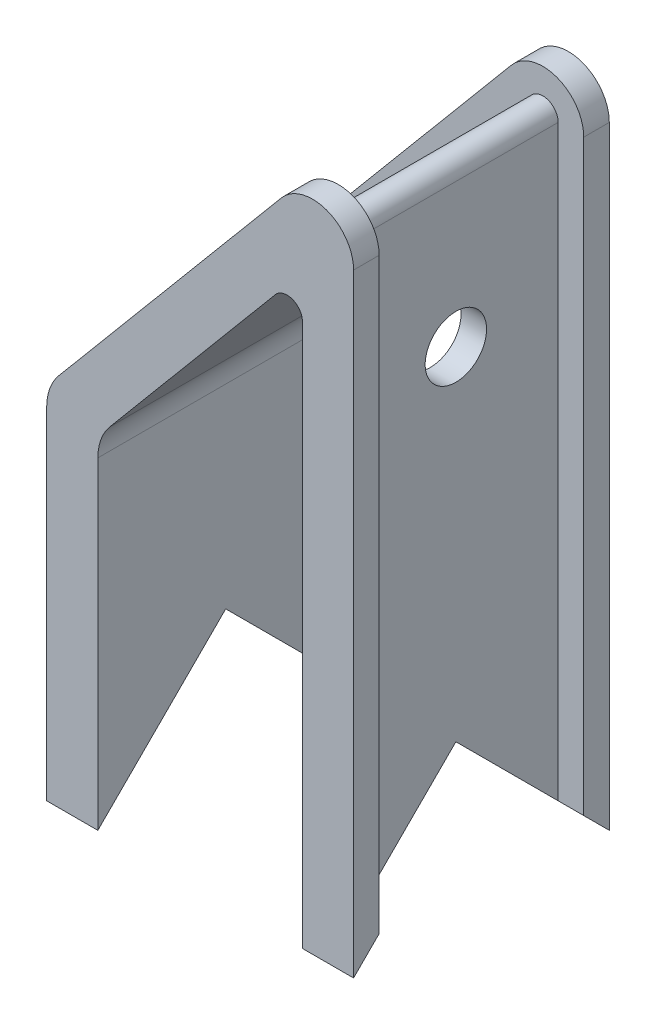
ISO-10303-21;
HEADER;
FILE_DESCRIPTION(('STEP AP214'),'2;1');
FILE_NAME('part.step','',(''),(''),'','','');
FILE_SCHEMA(('AUTOMOTIVE_DESIGN { 1 0 10303 214 1 1 1 1 }'));
ENDSEC;
DATA;
#1=APPLICATION_CONTEXT('core data for automotive mechanical design processes');
#2=APPLICATION_PROTOCOL_DEFINITION('international standard','automotive_design',2000,#1);
#3=PRODUCT_CONTEXT('',#1,'mechanical');
#4=PRODUCT('Part','Part','',(#3));
#5=PRODUCT_RELATED_PRODUCT_CATEGORY('part','',(#4));
#6=PRODUCT_DEFINITION_FORMATION('','',#4);
#7=PRODUCT_DEFINITION_CONTEXT('part definition',#1,'design');
#8=PRODUCT_DEFINITION('design','',#6,#7);
#9=PRODUCT_DEFINITION_SHAPE('','',#8);
#10=(LENGTH_UNIT() NAMED_UNIT(*) SI_UNIT(.MILLI.,.METRE.));
#11=(NAMED_UNIT(*) PLANE_ANGLE_UNIT() SI_UNIT($,.RADIAN.));
#12=(NAMED_UNIT(*) SI_UNIT($,.STERADIAN.) SOLID_ANGLE_UNIT());
#13=UNCERTAINTY_MEASURE_WITH_UNIT(LENGTH_MEASURE(1.E-05),#10,'distance_accuracy_value','');
#14=(GEOMETRIC_REPRESENTATION_CONTEXT(3) GLOBAL_UNCERTAINTY_ASSIGNED_CONTEXT((#13)) GLOBAL_UNIT_ASSIGNED_CONTEXT((#10,
#11,#12)) REPRESENTATION_CONTEXT('',''));
#15=CARTESIAN_POINT('',(0.,0.,0.));
#16=DIRECTION('',(0.,0.,1.));
#17=DIRECTION('',(1.,0.,0.));
#18=AXIS2_PLACEMENT_3D('',#15,#16,#17);
#19=CARTESIAN_POINT('',(5.,-20.7161125319693,50.));
#20=DIRECTION('',(-1.,0.,0.));
#21=DIRECTION('',(0.,0.,1.));
#22=AXIS2_PLACEMENT_3D('',#19,#20,#21);
#23=PLANE('',#22);
#24=DIRECTION('',(0.,1.,0.));
#25=VECTOR('',#24,1.);
#26=CARTESIAN_POINT('',(5.,-20.7161125319693,5.));
#27=LINE('',#26,#25);
#28=CARTESIAN_POINT('',(5.,-0.829803518152818,5.));
#29=VERTEX_POINT('',#28);
#30=CARTESIAN_POINT('',(5.,114.041455209667,4.99999999999999));
#31=VERTEX_POINT('',#30);
#32=EDGE_CURVE('E258',#29,#31,#27,.T.);
#33=ORIENTED_EDGE('',*,*,#32,.F.);
#34=DIRECTION('',(0.,0.7071067811865,0.707106781186595));
#35=VECTOR('',#34,1.);
#36=CARTESIAN_POINT('',(5.,-5.82980351815215,0.));
#37=LINE('',#36,#35);
#38=CARTESIAN_POINT('',(5.,-5.82980351815215,0.));
#39=VERTEX_POINT('',#38);
#40=EDGE_CURVE('E238',#39,#29,#37,.T.);
#41=ORIENTED_EDGE('',*,*,#40,.F.);
#42=DIRECTION('',(0.,1.,0.));
#43=VECTOR('',#42,1.);
#44=CARTESIAN_POINT('',(5.,-20.7161125319693,0.));
#45=LINE('',#44,#43);
#46=CARTESIAN_POINT('',(5.,114.041455209667,0.));
#47=VERTEX_POINT('',#46);
#48=EDGE_CURVE('E246',#39,#47,#45,.T.);
#49=ORIENTED_EDGE('',*,*,#48,.T.);
#50=DIRECTION('',(0.,0.,-1.));
#51=VECTOR('',#50,1.);
#52=CARTESIAN_POINT('',(5.,114.041455209667,50.));
#53=LINE('',#52,#51);
#54=EDGE_CURVE('E254',#47,#31,#53,.F.);
#55=ORIENTED_EDGE('',*,*,#54,.T.);
#56=EDGE_LOOP('',(#33,#41,#49,#55));
#57=FACE_BOUND('',#56,.T.);
#58=ADVANCED_FACE('F44',(#57),#23,.F.);
#59=DIRECTION('',(0.,1.,0.));
#60=VECTOR('',#59,1.);
#61=CARTESIAN_POINT('',(5.,-20.7161125319693,50.));
#62=LINE('',#61,#60);
#63=CARTESIAN_POINT('',(5.,-5.82980351815547,50.));
#64=VERTEX_POINT('',#63);
#65=CARTESIAN_POINT('',(5.,114.041455209667,50.));
#66=VERTEX_POINT('',#65);
#67=EDGE_CURVE('E278',#64,#66,#62,.T.);
#68=ORIENTED_EDGE('',*,*,#67,.F.);
#69=DIRECTION('',(0.,-0.707106781186547,0.707106781186548));
#70=VECTOR('',#69,1.);
#71=CARTESIAN_POINT('',(5.,19.1701964818445,25.));
#72=LINE('',#71,#70);
#73=CARTESIAN_POINT('',(5.,-0.829803518155477,45.));
#74=VERTEX_POINT('',#73);
#75=EDGE_CURVE('E96',#74,#64,#72,.T.);
#76=ORIENTED_EDGE('',*,*,#75,.F.);
#77=DIRECTION('',(0.,-1.,0.));
#78=VECTOR('',#77,1.);
#79=CARTESIAN_POINT('',(5.,-20.7161125319693,45.));
#80=LINE('',#79,#78);
#81=CARTESIAN_POINT('',(5.,114.041455209667,45.));
#82=VERTEX_POINT('',#81);
#83=EDGE_CURVE('E281',#82,#74,#80,.T.);
#84=ORIENTED_EDGE('',*,*,#83,.F.);
#85=DIRECTION('',(0.,0.,-1.));
#86=VECTOR('',#85,1.);
#87=CARTESIAN_POINT('',(5.,114.041455209667,50.));
#88=LINE('',#87,#86);
#89=EDGE_CURVE('E330',#82,#66,#88,.F.);
#90=ORIENTED_EDGE('',*,*,#89,.T.);
#91=EDGE_LOOP('',(#68,#76,#84,#90));
#92=FACE_BOUND('',#91,.T.);
#93=ADVANCED_FACE('F327',(#92),#23,.F.);
#94=CARTESIAN_POINT('',(5.,136.021274565304,50.));
#95=DIRECTION('',(0.766044443118977,-0.64278760968654,0.));
#96=DIRECTION('',(0.64278760968654,0.766044443118977,0.));
#97=AXIS2_PLACEMENT_3D('',#94,#95,#96);
#98=PLANE('',#97);
#99=DIRECTION('',(-0.64278760968654,-0.766044443118977,0.));
#100=VECTOR('',#99,1.);
#101=CARTESIAN_POINT('',(5.,136.021274565304,50.));
#102=LINE('',#101,#100);
#103=CARTESIAN_POINT('',(-9.12835554495182,119.183756087159,50.));
#104=VERTEX_POINT('',#103);
#105=CARTESIAN_POINT('',(-52.6604444311898,67.3042327638547,50.));
#106=VERTEX_POINT('',#105);
#107=EDGE_CURVE('E339',#104,#106,#102,.T.);
#108=ORIENTED_EDGE('',*,*,#107,.F.);
#109=DIRECTION('',(0.,0.,-1.));
#110=VECTOR('',#109,1.);
#111=CARTESIAN_POINT('',(-9.12835554495182,119.183756087159,50.));
#112=LINE('',#111,#110);
#113=CARTESIAN_POINT('',(-9.12835554495182,119.183756087159,45.));
#114=VERTEX_POINT('',#113);
#115=EDGE_CURVE('E333',#104,#114,#112,.T.);
#116=ORIENTED_EDGE('',*,*,#115,.T.);
#117=DIRECTION('',(0.64278760968654,0.766044443118977,0.));
#118=VECTOR('',#117,1.);
#119=CARTESIAN_POINT('',(-19.7895698622391,106.478215623115,45.));
#120=LINE('',#119,#118);
#121=CARTESIAN_POINT('',(-52.6604444311898,67.3042327638547,45.));
#122=VERTEX_POINT('',#121);
#123=EDGE_CURVE('E350',#122,#114,#120,.T.);
#124=ORIENTED_EDGE('',*,*,#123,.F.);
#125=DIRECTION('',(0.,0.,-1.));
#126=VECTOR('',#125,1.);
#127=CARTESIAN_POINT('',(-52.6604444311898,67.3042327638547,50.));
#128=LINE('',#127,#126);
#129=EDGE_CURVE('E352',#122,#106,#128,.F.);
#130=ORIENTED_EDGE('',*,*,#129,.T.);
#131=EDGE_LOOP('',(#108,#116,#124,#130));
#132=FACE_BOUND('',#131,.T.);
#133=ADVANCED_FACE('F488',(#132),#98,.F.);
#134=DIRECTION('',(-0.64278760968654,-0.766044443118977,0.));
#135=VECTOR('',#134,1.);
#136=CARTESIAN_POINT('',(-17.7236903064065,108.940235005646,5.));
#137=LINE('',#136,#135);
#138=CARTESIAN_POINT('',(-9.12835554495182,119.183756087159,5.));
#139=VERTEX_POINT('',#138);
#140=CARTESIAN_POINT('',(-52.6604444311898,67.3042327638547,5.));
#141=VERTEX_POINT('',#140);
#142=EDGE_CURVE('E354',#139,#141,#137,.T.);
#143=ORIENTED_EDGE('',*,*,#142,.F.);
#144=DIRECTION('',(0.,0.,-1.));
#145=VECTOR('',#144,1.);
#146=CARTESIAN_POINT('',(-9.12835554495182,119.183756087159,50.));
#147=LINE('',#146,#145);
#148=CARTESIAN_POINT('',(-9.12835554495182,119.183756087159,0.));
#149=VERTEX_POINT('',#148);
#150=EDGE_CURVE('E359',#139,#149,#147,.T.);
#151=ORIENTED_EDGE('',*,*,#150,.T.);
#152=DIRECTION('',(-0.64278760968654,-0.766044443118977,0.));
#153=VECTOR('',#152,1.);
#154=CARTESIAN_POINT('',(5.,136.021274565304,0.));
#155=LINE('',#154,#153);
#156=CARTESIAN_POINT('',(-52.6604444311898,67.3042327638547,0.));
#157=VERTEX_POINT('',#156);
#158=EDGE_CURVE('E362',#149,#157,#155,.T.);
#159=ORIENTED_EDGE('',*,*,#158,.T.);
#160=DIRECTION('',(0.,0.,-1.));
#161=VECTOR('',#160,1.);
#162=CARTESIAN_POINT('',(-52.6604444311898,67.3042327638547,50.));
#163=LINE('',#162,#161);
#164=EDGE_CURVE('E302',#157,#141,#163,.F.);
#165=ORIENTED_EDGE('',*,*,#164,.T.);
#166=EDGE_LOOP('',(#143,#151,#159,#165));
#167=FACE_BOUND('',#166,.T.);
#168=ADVANCED_FACE('F490',(#167),#98,.F.);
#169=CARTESIAN_POINT('',(-55.,64.5160590096513,50.));
#170=DIRECTION('',(1.,0.,0.));
#171=DIRECTION('',(0.,1.,0.));
#172=AXIS2_PLACEMENT_3D('',#169,#170,#171);
#173=PLANE('',#172);
#174=DIRECTION('',(0.,-1.,0.));
#175=VECTOR('',#174,1.);
#176=CARTESIAN_POINT('',(-55.,64.5160590096513,0.));
#177=LINE('',#176,#175);
#178=CARTESIAN_POINT('',(-55.,60.8763566669893,0.));
#179=VERTEX_POINT('',#178);
#180=CARTESIAN_POINT('',(-55.,-5.82980351815215,0.));
#181=VERTEX_POINT('',#180);
#182=EDGE_CURVE('E272',#179,#181,#177,.T.);
#183=ORIENTED_EDGE('',*,*,#182,.T.);
#184=DIRECTION('',(0.,0.7071067811865,0.707106781186595));
#185=VECTOR('',#184,1.);
#186=CARTESIAN_POINT('',(-55.,-5.82980351815215,0.));
#187=LINE('',#186,#185);
#188=CARTESIAN_POINT('',(-55.,-0.829803518152818,5.));
#189=VERTEX_POINT('',#188);
#190=EDGE_CURVE('E268',#181,#189,#187,.T.);
#191=ORIENTED_EDGE('',*,*,#190,.T.);
#192=DIRECTION('',(0.,-1.,0.));
#193=VECTOR('',#192,1.);
#194=CARTESIAN_POINT('',(-55.,136.023274565304,5.));
#195=LINE('',#194,#193);
#196=CARTESIAN_POINT('',(-55.,60.8763566669893,5.));
#197=VERTEX_POINT('',#196);
#198=EDGE_CURVE('E306',#197,#189,#195,.T.);
#199=ORIENTED_EDGE('',*,*,#198,.F.);
#200=DIRECTION('',(0.,0.,-1.));
#201=VECTOR('',#200,1.);
#202=CARTESIAN_POINT('',(-55.,60.8763566669893,50.));
#203=LINE('',#202,#201);
#204=EDGE_CURVE('E271',#197,#179,#203,.T.);
#205=ORIENTED_EDGE('',*,*,#204,.T.);
#206=EDGE_LOOP('',(#183,#191,#199,#205));
#207=FACE_BOUND('',#206,.T.);
#208=ADVANCED_FACE('F469',(#207),#173,.F.);
#209=DIRECTION('',(0.,-1.,0.));
#210=VECTOR('',#209,1.);
#211=CARTESIAN_POINT('',(-55.,136.023274565304,45.));
#212=LINE('',#211,#210);
#213=CARTESIAN_POINT('',(-55.,60.8763566669893,45.));
#214=VERTEX_POINT('',#213);
#215=CARTESIAN_POINT('',(-55.,-0.829803518155481,45.));
#216=VERTEX_POINT('',#215);
#217=EDGE_CURVE('E267',#214,#216,#212,.T.);
#218=ORIENTED_EDGE('',*,*,#217,.T.);
#219=DIRECTION('',(0.,-0.707106781186547,0.707106781186548));
#220=VECTOR('',#219,1.);
#221=CARTESIAN_POINT('',(-55.,19.1701964818445,25.));
#222=LINE('',#221,#220);
#223=CARTESIAN_POINT('',(-55.,-5.82980351815547,50.));
#224=VERTEX_POINT('',#223);
#225=EDGE_CURVE('E226',#216,#224,#222,.T.);
#226=ORIENTED_EDGE('',*,*,#225,.T.);
#227=DIRECTION('',(0.,-1.,0.));
#228=VECTOR('',#227,1.);
#229=CARTESIAN_POINT('',(-55.,64.5160590096513,50.));
#230=LINE('',#229,#228);
#231=CARTESIAN_POINT('',(-55.,60.8763566669893,50.));
#232=VERTEX_POINT('',#231);
#233=EDGE_CURVE('E292',#232,#224,#230,.T.);
#234=ORIENTED_EDGE('',*,*,#233,.F.);
#235=DIRECTION('',(0.,0.,-1.));
#236=VECTOR('',#235,1.);
#237=CARTESIAN_POINT('',(-55.,60.8763566669893,50.));
#238=LINE('',#237,#236);
#239=EDGE_CURVE('E266',#232,#214,#238,.T.);
#240=ORIENTED_EDGE('',*,*,#239,.T.);
#241=EDGE_LOOP('',(#218,#226,#234,#240));
#242=FACE_BOUND('',#241,.T.);
#243=ADVANCED_FACE('F46',(#242),#173,.F.);
#244=CARTESIAN_POINT('',(-45.,60.8763566669893,50.));
#245=DIRECTION('',(-1.,0.,0.));
#246=DIRECTION('',(0.,-1.,0.));
#247=AXIS2_PLACEMENT_3D('',#244,#245,#246);
#248=PLANE('',#247);
#249=DIRECTION('',(0.,1.,0.));
#250=VECTOR('',#249,1.);
#251=CARTESIAN_POINT('',(-45.,60.8763566669893,50.));
#252=LINE('',#251,#250);
#253=CARTESIAN_POINT('',(-45.,-5.82980351815547,50.));
#254=VERTEX_POINT('',#253);
#255=CARTESIAN_POINT('',(-45.,57.2366543243273,50.));
#256=VERTEX_POINT('',#255);
#257=EDGE_CURVE('E316',#254,#256,#252,.T.);
#258=ORIENTED_EDGE('',*,*,#257,.F.);
#259=DIRECTION('',(0.,0.707106781186547,-0.707106781186548));
#260=VECTOR('',#259,1.);
#261=CARTESIAN_POINT('',(-45.,27.5232765744168,16.6469199074276));
#262=LINE('',#261,#260);
#263=CARTESIAN_POINT('',(-45.,19.1701964818445,25.));
#264=VERTEX_POINT('',#263);
#265=EDGE_CURVE('E403',#254,#264,#262,.T.);
#266=ORIENTED_EDGE('',*,*,#265,.T.);
#267=DIRECTION('',(0.,-0.7071067811865,-0.707106781186595));
#268=VECTOR('',#267,1.);
#269=CARTESIAN_POINT('',(-45.,52.5232765744141,58.3530800925741));
#270=LINE('',#269,#268);
#271=CARTESIAN_POINT('',(-45.,-5.82980351815215,0.));
#272=VERTEX_POINT('',#271);
#273=EDGE_CURVE('E63',#264,#272,#270,.T.);
#274=ORIENTED_EDGE('',*,*,#273,.T.);
#275=DIRECTION('',(0.,1.,0.));
#276=VECTOR('',#275,1.);
#277=CARTESIAN_POINT('',(-45.,60.8763566669893,0.));
#278=LINE('',#277,#276);
#279=CARTESIAN_POINT('',(-45.,57.2366543243273,0.));
#280=VERTEX_POINT('',#279);
#281=EDGE_CURVE('E303',#272,#280,#278,.T.);
#282=ORIENTED_EDGE('',*,*,#281,.T.);
#283=DIRECTION('',(0.,0.,-1.));
#284=VECTOR('',#283,1.);
#285=CARTESIAN_POINT('',(-45.,57.2366543243273,50.));
#286=LINE('',#285,#284);
#287=EDGE_CURVE('E305',#280,#256,#286,.F.);
#288=ORIENTED_EDGE('',*,*,#287,.T.);
#289=EDGE_LOOP('',(#258,#266,#274,#282,#288));
#290=FACE_BOUND('',#289,.T.);
#291=ADVANCED_FACE('F477',(#290),#248,.F.);
#292=CARTESIAN_POINT('',(-5.,108.546500370758,50.));
#293=DIRECTION('',(-0.766044443118977,0.64278760968654,0.));
#294=DIRECTION('',(-0.64278760968654,-0.766044443118977,0.));
#295=AXIS2_PLACEMENT_3D('',#292,#293,#294);
#296=PLANE('',#295);
#297=CARTESIAN_POINT('',(-20.7515394043582,89.7745466967245,25.));
#298=DIRECTION('',(-0.766044443118977,0.64278760968654,0.));
#299=DIRECTION('',(-0.64278760968654,-0.766044443118977,0.));
#300=AXIS2_PLACEMENT_3D('',#297,#298,#299);
#301=CIRCLE('',#300,6.);
#302=CARTESIAN_POINT('',(-24.6082650624775,85.1782800380106,25.));
#303=VERTEX_POINT('',#302);
#304=EDGE_CURVE('E255',#303,#303,#301,.F.);
#305=ORIENTED_EDGE('',*,*,#304,.F.);
#306=EDGE_LOOP('',(#305));
#307=FACE_BOUND('',#306,.T.);
#308=DIRECTION('',(0.64278760968654,0.766044443118977,0.));
#309=VECTOR('',#308,1.);
#310=CARTESIAN_POINT('',(-5.,108.546500370758,0.));
#311=LINE('',#310,#309);
#312=CARTESIAN_POINT('',(-42.6604444311898,63.6645304211927,0.));
#313=VERTEX_POINT('',#312);
#314=CARTESIAN_POINT('',(-10.2981333293569,102.232430941453,0.));
#315=VERTEX_POINT('',#314);
#316=EDGE_CURVE('E374',#313,#315,#311,.T.);
#317=ORIENTED_EDGE('',*,*,#316,.T.);
#318=DIRECTION('',(0.,0.,-1.));
#319=VECTOR('',#318,1.);
#320=CARTESIAN_POINT('',(-10.2981333293569,102.232430941453,50.));
#321=LINE('',#320,#319);
#322=CARTESIAN_POINT('',(-10.2981333293569,102.232430941453,50.));
#323=VERTEX_POINT('',#322);
#324=EDGE_CURVE('E371',#315,#323,#321,.F.);
#325=ORIENTED_EDGE('',*,*,#324,.T.);
#326=DIRECTION('',(0.64278760968654,0.766044443118977,0.));
#327=VECTOR('',#326,1.);
#328=CARTESIAN_POINT('',(-5.,108.546500370758,50.));
#329=LINE('',#328,#327);
#330=CARTESIAN_POINT('',(-42.6604444311898,63.6645304211927,50.));
#331=VERTEX_POINT('',#330);
#332=EDGE_CURVE('E364',#331,#323,#329,.T.);
#333=ORIENTED_EDGE('',*,*,#332,.F.);
#334=DIRECTION('',(0.,0.,-1.));
#335=VECTOR('',#334,1.);
#336=CARTESIAN_POINT('',(-42.6604444311898,63.6645304211927,0.));
#337=LINE('',#336,#335);
#338=EDGE_CURVE('E373',#331,#313,#337,.T.);
#339=ORIENTED_EDGE('',*,*,#338,.T.);
#340=EDGE_LOOP('',(#317,#325,#333,#339));
#341=FACE_BOUND('',#340,.T.);
#342=ADVANCED_FACE('F517',(#307,#341),#296,.F.);
#343=CARTESIAN_POINT('',(-5.,-20.7161125319693,50.));
#344=DIRECTION('',(1.,0.,0.));
#345=DIRECTION('',(0.,0.,-1.));
#346=AXIS2_PLACEMENT_3D('',#343,#344,#345);
#347=PLANE('',#346);
#348=CARTESIAN_POINT('',(-5.,86.0414552096669,25.));
#349=DIRECTION('',(1.,0.,0.));
#350=DIRECTION('',(0.,0.,-1.));
#351=AXIS2_PLACEMENT_3D('',#348,#349,#350);
#352=CIRCLE('',#351,6.00000000000001);
#353=CARTESIAN_POINT('',(-5.,86.0414552096669,19.));
#354=VERTEX_POINT('',#353);
#355=EDGE_CURVE('E822',#354,#354,#352,.F.);
#356=ORIENTED_EDGE('',*,*,#355,.F.);
#357=EDGE_LOOP('',(#356));
#358=FACE_BOUND('',#357,.T.);
#359=DIRECTION('',(0.,0.7071067811865,0.707106781186595));
#360=VECTOR('',#359,1.);
#361=CARTESIAN_POINT('',(-5.,11.7270419749403,17.5568454930948));
#362=LINE('',#361,#360);
#363=CARTESIAN_POINT('',(-5.,-5.82980351815215,0.));
#364=VERTEX_POINT('',#363);
#365=CARTESIAN_POINT('',(-5.,19.1701964818445,25.));
#366=VERTEX_POINT('',#365);
#367=EDGE_CURVE('E240',#364,#366,#362,.T.);
#368=ORIENTED_EDGE('',*,*,#367,.T.);
#369=DIRECTION('',(0.,-0.707106781186547,0.707106781186548));
#370=VECTOR('',#369,1.);
#371=CARTESIAN_POINT('',(-5.,-13.2729580250624,57.4431545069069));
#372=LINE('',#371,#370);
#373=CARTESIAN_POINT('',(-5.,-5.82980351815547,50.));
#374=VERTEX_POINT('',#373);
#375=EDGE_CURVE('E377',#366,#374,#372,.T.);
#376=ORIENTED_EDGE('',*,*,#375,.T.);
#377=DIRECTION('',(0.,-1.,0.));
#378=VECTOR('',#377,1.);
#379=CARTESIAN_POINT('',(-5.,-20.7161125319693,50.));
#380=LINE('',#379,#378);
#381=CARTESIAN_POINT('',(-5.,100.304068112394,50.));
#382=VERTEX_POINT('',#381);
#383=EDGE_CURVE('E273',#382,#374,#380,.T.);
#384=ORIENTED_EDGE('',*,*,#383,.F.);
#385=DIRECTION('',(0.,0.,-1.));
#386=VECTOR('',#385,1.);
#387=CARTESIAN_POINT('',(-5.,100.304068112394,0.));
#388=LINE('',#387,#386);
#389=CARTESIAN_POINT('',(-5.,100.304068112394,0.));
#390=VERTEX_POINT('',#389);
#391=EDGE_CURVE('E293',#382,#390,#388,.T.);
#392=ORIENTED_EDGE('',*,*,#391,.T.);
#393=DIRECTION('',(0.,-1.,0.));
#394=VECTOR('',#393,1.);
#395=CARTESIAN_POINT('',(-5.,-20.7161125319693,0.));
#396=LINE('',#395,#394);
#397=EDGE_CURVE('E290',#390,#364,#396,.T.);
#398=ORIENTED_EDGE('',*,*,#397,.T.);
#399=EDGE_LOOP('',(#368,#376,#384,#392,#398));
#400=FACE_BOUND('',#399,.T.);
#401=ADVANCED_FACE('F505',(#358,#400),#347,.F.);
#402=CARTESIAN_POINT('',(0.,0.,50.));
#403=DIRECTION('',(0.,0.,-1.));
#404=DIRECTION('',(-1.,0.,0.));
#405=AXIS2_PLACEMENT_3D('',#402,#403,#404);
#406=PLANE('',#405);
#407=ORIENTED_EDGE('',*,*,#233,.T.);
#408=DIRECTION('',(1.,0.,0.));
#409=VECTOR('',#408,1.);
#410=CARTESIAN_POINT('',(-55.,-5.82980351815547,50.));
#411=LINE('',#410,#409);
#412=EDGE_CURVE('E229',#224,#254,#411,.T.);
#413=ORIENTED_EDGE('',*,*,#412,.T.);
#414=ORIENTED_EDGE('',*,*,#257,.T.);
#415=CARTESIAN_POINT('',(-35.,57.2366543243273,50.));
#416=DIRECTION('',(0.,0.,-1.));
#417=DIRECTION('',(-1.,0.,0.));
#418=AXIS2_PLACEMENT_3D('',#415,#416,#417);
#419=CIRCLE('',#418,10.);
#420=EDGE_CURVE('E317',#256,#331,#419,.T.);
#421=ORIENTED_EDGE('',*,*,#420,.T.);
#422=ORIENTED_EDGE('',*,*,#332,.T.);
#423=CARTESIAN_POINT('',(-8.,100.304068112394,50.));
#424=DIRECTION('',(0.,0.,-1.));
#425=DIRECTION('',(-1.,0.,0.));
#426=AXIS2_PLACEMENT_3D('',#423,#424,#425);
#427=CIRCLE('',#426,3.);
#428=EDGE_CURVE('E277',#323,#382,#427,.T.);
#429=ORIENTED_EDGE('',*,*,#428,.T.);
#430=ORIENTED_EDGE('',*,*,#383,.T.);
#431=EDGE_CURVE('E276',#374,#64,#411,.T.);
#432=ORIENTED_EDGE('',*,*,#431,.T.);
#433=ORIENTED_EDGE('',*,*,#67,.T.);
#434=CARTESIAN_POINT('',(-3.,114.041455209667,50.));
#435=DIRECTION('',(0.,0.,-1.));
#436=DIRECTION('',(-1.,0.,0.));
#437=AXIS2_PLACEMENT_3D('',#434,#435,#436);
#438=CIRCLE('',#437,8.);
#439=EDGE_CURVE('E280',#66,#104,#438,.F.);
#440=ORIENTED_EDGE('',*,*,#439,.T.);
#441=ORIENTED_EDGE('',*,*,#107,.T.);
#442=CARTESIAN_POINT('',(-45.,60.8763566669893,50.));
#443=DIRECTION('',(0.,0.,-1.));
#444=DIRECTION('',(-1.,0.,0.));
#445=AXIS2_PLACEMENT_3D('',#442,#443,#444);
#446=CIRCLE('',#445,10.);
#447=EDGE_CURVE('E341',#106,#232,#446,.F.);
#448=ORIENTED_EDGE('',*,*,#447,.T.);
#449=EDGE_LOOP('',(#407,#413,#414,#421,#422,#429,#430,#432,#433,#440,#441,#448));
#450=FACE_BOUND('',#449,.T.);
#451=ADVANCED_FACE('F322',(#450),#406,.F.);
#452=CARTESIAN_POINT('',(0.,0.,0.));
#453=DIRECTION('',(0.,0.,-1.));
#454=DIRECTION('',(-1.,0.,0.));
#455=AXIS2_PLACEMENT_3D('',#452,#453,#454);
#456=PLANE('',#455);
#457=DIRECTION('',(1.,0.,0.));
#458=VECTOR('',#457,1.);
#459=CARTESIAN_POINT('',(-55.,-5.82980351815215,0.));
#460=LINE('',#459,#458);
#461=EDGE_CURVE('E11',#181,#272,#460,.T.);
#462=ORIENTED_EDGE('',*,*,#461,.F.);
#463=ORIENTED_EDGE('',*,*,#182,.F.);
#464=CARTESIAN_POINT('',(-45.,60.8763566669893,0.));
#465=DIRECTION('',(0.,0.,-1.));
#466=DIRECTION('',(-1.,0.,0.));
#467=AXIS2_PLACEMENT_3D('',#464,#465,#466);
#468=CIRCLE('',#467,10.);
#469=EDGE_CURVE('E358',#179,#157,#468,.T.);
#470=ORIENTED_EDGE('',*,*,#469,.T.);
#471=ORIENTED_EDGE('',*,*,#158,.F.);
#472=CARTESIAN_POINT('',(-3.,114.041455209667,0.));
#473=DIRECTION('',(0.,0.,-1.));
#474=DIRECTION('',(-1.,0.,0.));
#475=AXIS2_PLACEMENT_3D('',#472,#473,#474);
#476=CIRCLE('',#475,8.);
#477=EDGE_CURVE('E250',#149,#47,#476,.T.);
#478=ORIENTED_EDGE('',*,*,#477,.T.);
#479=ORIENTED_EDGE('',*,*,#48,.F.);
#480=EDGE_CURVE('E56',#364,#39,#460,.T.);
#481=ORIENTED_EDGE('',*,*,#480,.F.);
#482=ORIENTED_EDGE('',*,*,#397,.F.);
#483=CARTESIAN_POINT('',(-8.,100.304068112394,0.));
#484=DIRECTION('',(0.,0.,-1.));
#485=DIRECTION('',(-1.,0.,0.));
#486=AXIS2_PLACEMENT_3D('',#483,#484,#485);
#487=CIRCLE('',#486,3.);
#488=EDGE_CURVE('E357',#390,#315,#487,.F.);
#489=ORIENTED_EDGE('',*,*,#488,.T.);
#490=ORIENTED_EDGE('',*,*,#316,.F.);
#491=CARTESIAN_POINT('',(-35.,57.2366543243273,0.));
#492=DIRECTION('',(0.,0.,-1.));
#493=DIRECTION('',(-1.,0.,0.));
#494=AXIS2_PLACEMENT_3D('',#491,#492,#493);
#495=CIRCLE('',#494,10.);
#496=EDGE_CURVE('E310',#313,#280,#495,.F.);
#497=ORIENTED_EDGE('',*,*,#496,.T.);
#498=ORIENTED_EDGE('',*,*,#281,.F.);
#499=EDGE_LOOP('',(#462,#463,#470,#471,#478,#479,#481,#482,#489,#490,#497,#498));
#500=FACE_BOUND('',#499,.T.);
#501=ADVANCED_FACE('F248',(#500),#456,.T.);
#502=CARTESIAN_POINT('',(-50.,136.023274565304,5.));
#503=DIRECTION('',(0.,0.,-1.));
#504=DIRECTION('',(-1.,0.,0.));
#505=AXIS2_PLACEMENT_3D('',#502,#503,#504);
#506=PLANE('',#505);
#507=ORIENTED_EDGE('',*,*,#198,.T.);
#508=DIRECTION('',(1.,0.,0.));
#509=VECTOR('',#508,1.);
#510=CARTESIAN_POINT('',(-50.,-0.829803518152816,5.));
#511=LINE('',#510,#509);
#512=CARTESIAN_POINT('',(-50.,-0.82980351815283,5.));
#513=VERTEX_POINT('',#512);
#514=EDGE_CURVE('E309',#189,#513,#511,.T.);
#515=ORIENTED_EDGE('',*,*,#514,.T.);
#516=DIRECTION('',(0.,-1.,0.));
#517=VECTOR('',#516,1.);
#518=CARTESIAN_POINT('',(-50.,136.023274565304,5.));
#519=LINE('',#518,#517);
#520=CARTESIAN_POINT('',(-50.,59.0565054956583,5.));
#521=VERTEX_POINT('',#520);
#522=EDGE_CURVE('E284',#521,#513,#519,.T.);
#523=ORIENTED_EDGE('',*,*,#522,.F.);
#524=CARTESIAN_POINT('',(-40.,59.0565054956583,5.));
#525=DIRECTION('',(0.,0.,-1.));
#526=DIRECTION('',(-1.,0.,0.));
#527=AXIS2_PLACEMENT_3D('',#524,#525,#526);
#528=CIRCLE('',#527,10.);
#529=CARTESIAN_POINT('',(-47.6604444311898,65.4843815925237,4.99999999999999));
#530=VERTEX_POINT('',#529);
#531=EDGE_CURVE('E386',#521,#530,#528,.T.);
#532=ORIENTED_EDGE('',*,*,#531,.T.);
#533=DIRECTION('',(0.64278760968654,0.766044443118977,0.));
#534=VECTOR('',#533,1.);
#535=CARTESIAN_POINT('',(-62.2394680265686,48.1097778462153,4.99999999999999));
#536=LINE('',#535,#534);
#537=CARTESIAN_POINT('',(-5.29813332935692,115.969818038726,5.));
#538=VERTEX_POINT('',#537);
#539=EDGE_CURVE('E370',#530,#538,#536,.T.);
#540=ORIENTED_EDGE('',*,*,#539,.T.);
#541=CARTESIAN_POINT('',(-3.,114.041455209667,5.));
#542=DIRECTION('',(0.,0.,-1.));
#543=DIRECTION('',(-1.,0.,0.));
#544=AXIS2_PLACEMENT_3D('',#541,#542,#543);
#545=CIRCLE('',#544,3.);
#546=CARTESIAN_POINT('',(0.,114.041455209667,5.));
#547=VERTEX_POINT('',#546);
#548=EDGE_CURVE('E297',#538,#547,#545,.T.);
#549=ORIENTED_EDGE('',*,*,#548,.T.);
#550=DIRECTION('',(0.,-1.,0.));
#551=VECTOR('',#550,1.);
#552=CARTESIAN_POINT('',(0.,128.242655431002,5.));
#553=LINE('',#552,#551);
#554=CARTESIAN_POINT('',(0.,-0.829803518152795,5.00000000000001));
#555=VERTEX_POINT('',#554);
#556=EDGE_CURVE('E294',#547,#555,#553,.T.);
#557=ORIENTED_EDGE('',*,*,#556,.T.);
#558=EDGE_CURVE('E116',#555,#29,#511,.T.);
#559=ORIENTED_EDGE('',*,*,#558,.T.);
#560=ORIENTED_EDGE('',*,*,#32,.T.);
#561=CARTESIAN_POINT('',(-3.,114.041455209667,5.));
#562=DIRECTION('',(0.,0.,-1.));
#563=DIRECTION('',(-1.,0.,0.));
#564=AXIS2_PLACEMENT_3D('',#561,#562,#563);
#565=CIRCLE('',#564,8.);
#566=EDGE_CURVE('E299',#31,#139,#565,.F.);
#567=ORIENTED_EDGE('',*,*,#566,.T.);
#568=ORIENTED_EDGE('',*,*,#142,.T.);
#569=CARTESIAN_POINT('',(-45.,60.8763566669893,5.));
#570=DIRECTION('',(0.,0.,-1.));
#571=DIRECTION('',(-1.,0.,0.));
#572=AXIS2_PLACEMENT_3D('',#569,#570,#571);
#573=CIRCLE('',#572,10.);
#574=EDGE_CURVE('E404',#141,#197,#573,.F.);
#575=ORIENTED_EDGE('',*,*,#574,.T.);
#576=EDGE_LOOP('',(#507,#515,#523,#532,#540,#549,#557,#559,#560,#567,#568,#575));
#577=FACE_BOUND('',#576,.T.);
#578=ADVANCED_FACE('F442',(#577),#506,.F.);
#579=CARTESIAN_POINT('',(-50.,136.023274565304,45.));
#580=DIRECTION('',(1.,0.,0.));
#581=DIRECTION('',(0.,0.,-1.));
#582=AXIS2_PLACEMENT_3D('',#579,#580,#581);
#583=PLANE('',#582);
#584=DIRECTION('',(0.,0.7071067811865,0.707106781186595));
#585=VECTOR('',#584,1.);
#586=CARTESIAN_POINT('',(-50.,87.5967355235663,93.426539041731));
#587=LINE('',#586,#585);
#588=CARTESIAN_POINT('',(-50.,19.1701964818445,25.));
#589=VERTEX_POINT('',#588);
#590=EDGE_CURVE('E406',#513,#589,#587,.T.);
#591=ORIENTED_EDGE('',*,*,#590,.T.);
#592=DIRECTION('',(0.,-0.707106781186547,0.707106781186548));
#593=VECTOR('',#592,1.);
#594=CARTESIAN_POINT('',(-50.,67.596735523574,-23.4265390417296));
#595=LINE('',#594,#593);
#596=CARTESIAN_POINT('',(-50.,-0.829803518155481,45.));
#597=VERTEX_POINT('',#596);
#598=EDGE_CURVE('E395',#589,#597,#595,.T.);
#599=ORIENTED_EDGE('',*,*,#598,.T.);
#600=DIRECTION('',(0.,-1.,0.));
#601=VECTOR('',#600,1.);
#602=CARTESIAN_POINT('',(-50.,136.023274565304,45.));
#603=LINE('',#602,#601);
#604=CARTESIAN_POINT('',(-50.,59.0565054956583,45.));
#605=VERTEX_POINT('',#604);
#606=EDGE_CURVE('E48',#605,#597,#603,.T.);
#607=ORIENTED_EDGE('',*,*,#606,.F.);
#608=DIRECTION('',(0.,0.,-1.));
#609=VECTOR('',#608,1.);
#610=CARTESIAN_POINT('',(-50.,59.0565054956583,45.));
#611=LINE('',#610,#609);
#612=EDGE_CURVE('E313',#605,#521,#611,.T.);
#613=ORIENTED_EDGE('',*,*,#612,.T.);
#614=ORIENTED_EDGE('',*,*,#522,.T.);
#615=EDGE_LOOP('',(#591,#599,#607,#613,#614));
#616=FACE_BOUND('',#615,.T.);
#617=ADVANCED_FACE('F463',(#616),#583,.F.);
#618=CARTESIAN_POINT('',(-55.,136.023274565304,45.));
#619=DIRECTION('',(0.,0.,1.));
#620=DIRECTION('',(1.,0.,0.));
#621=AXIS2_PLACEMENT_3D('',#618,#619,#620);
#622=PLANE('',#621);
#623=ORIENTED_EDGE('',*,*,#83,.T.);
#624=DIRECTION('',(-1.,0.,0.));
#625=VECTOR('',#624,1.);
#626=CARTESIAN_POINT('',(-55.,-0.829803518155481,45.));
#627=LINE('',#626,#625);
#628=CARTESIAN_POINT('',(0.,-0.829803518155481,45.));
#629=VERTEX_POINT('',#628);
#630=EDGE_CURVE('E102',#74,#629,#627,.T.);
#631=ORIENTED_EDGE('',*,*,#630,.T.);
#632=DIRECTION('',(0.,-1.,0.));
#633=VECTOR('',#632,1.);
#634=CARTESIAN_POINT('',(0.,128.242655431002,45.));
#635=LINE('',#634,#633);
#636=CARTESIAN_POINT('',(0.,114.041455209667,45.));
#637=VERTEX_POINT('',#636);
#638=EDGE_CURVE('E285',#637,#629,#635,.T.);
#639=ORIENTED_EDGE('',*,*,#638,.F.);
#640=CARTESIAN_POINT('',(-3.,114.041455209667,45.));
#641=DIRECTION('',(0.,0.,1.));
#642=DIRECTION('',(1.,0.,0.));
#643=AXIS2_PLACEMENT_3D('',#640,#641,#642);
#644=CIRCLE('',#643,3.);
#645=CARTESIAN_POINT('',(-5.29813332935693,115.969818038726,45.));
#646=VERTEX_POINT('',#645);
#647=EDGE_CURVE('E366',#637,#646,#644,.T.);
#648=ORIENTED_EDGE('',*,*,#647,.T.);
#649=DIRECTION('',(0.64278760968654,0.766044443118977,0.));
#650=VECTOR('',#649,1.);
#651=CARTESIAN_POINT('',(-62.2394680265686,48.1097778462153,45.));
#652=LINE('',#651,#650);
#653=CARTESIAN_POINT('',(-47.6604444311898,65.4843815925237,45.));
#654=VERTEX_POINT('',#653);
#655=EDGE_CURVE('E349',#654,#646,#652,.T.);
#656=ORIENTED_EDGE('',*,*,#655,.F.);
#657=CARTESIAN_POINT('',(-40.,59.0565054956583,45.));
#658=DIRECTION('',(0.,0.,1.));
#659=DIRECTION('',(1.,0.,0.));
#660=AXIS2_PLACEMENT_3D('',#657,#658,#659);
#661=CIRCLE('',#660,10.);
#662=EDGE_CURVE('E368',#654,#605,#661,.T.);
#663=ORIENTED_EDGE('',*,*,#662,.T.);
#664=ORIENTED_EDGE('',*,*,#606,.T.);
#665=EDGE_CURVE('E221',#597,#216,#627,.T.);
#666=ORIENTED_EDGE('',*,*,#665,.T.);
#667=ORIENTED_EDGE('',*,*,#217,.F.);
#668=CARTESIAN_POINT('',(-45.,60.8763566669893,45.));
#669=DIRECTION('',(0.,0.,1.));
#670=DIRECTION('',(1.,0.,0.));
#671=AXIS2_PLACEMENT_3D('',#668,#669,#670);
#672=CIRCLE('',#671,10.);
#673=EDGE_CURVE('E399',#214,#122,#672,.F.);
#674=ORIENTED_EDGE('',*,*,#673,.T.);
#675=ORIENTED_EDGE('',*,*,#123,.T.);
#676=CARTESIAN_POINT('',(-3.,114.041455209667,45.));
#677=DIRECTION('',(0.,0.,1.));
#678=DIRECTION('',(1.,0.,0.));
#679=AXIS2_PLACEMENT_3D('',#676,#677,#678);
#680=CIRCLE('',#679,8.);
#681=EDGE_CURVE('E347',#114,#82,#680,.F.);
#682=ORIENTED_EDGE('',*,*,#681,.T.);
#683=EDGE_LOOP('',(#623,#631,#639,#648,#656,#663,#664,#666,#667,#674,#675,#682));
#684=FACE_BOUND('',#683,.T.);
#685=ADVANCED_FACE('F454',(#684),#622,.F.);
#686=CARTESIAN_POINT('',(-62.2394680265686,48.1097778462153,45.));
#687=DIRECTION('',(0.766044443118977,-0.64278760968654,0.));
#688=DIRECTION('',(0.64278760968654,0.766044443118977,0.));
#689=AXIS2_PLACEMENT_3D('',#686,#687,#688);
#690=PLANE('',#689);
#691=CARTESIAN_POINT('',(-24.5817616199531,92.9884847451572,25.));
#692=DIRECTION('',(-0.766044443118977,0.64278760968654,0.));
#693=DIRECTION('',(-0.64278760968654,-0.766044443118977,0.));
#694=AXIS2_PLACEMENT_3D('',#691,#692,#693);
#695=CIRCLE('',#694,6.);
#696=CARTESIAN_POINT('',(-28.4384872780724,88.3922180864433,25.));
#697=VERTEX_POINT('',#696);
#698=EDGE_CURVE('E344',#697,#697,#695,.T.);
#699=ORIENTED_EDGE('',*,*,#698,.F.);
#700=EDGE_LOOP('',(#699));
#701=FACE_BOUND('',#700,.T.);
#702=ORIENTED_EDGE('',*,*,#655,.T.);
#703=DIRECTION('',(0.,0.,-1.));
#704=VECTOR('',#703,1.);
#705=CARTESIAN_POINT('',(-5.29813332935693,115.969818038726,45.));
#706=LINE('',#705,#704);
#707=EDGE_CURVE('E379',#646,#538,#706,.T.);
#708=ORIENTED_EDGE('',*,*,#707,.T.);
#709=ORIENTED_EDGE('',*,*,#539,.F.);
#710=DIRECTION('',(0.,0.,-1.));
#711=VECTOR('',#710,1.);
#712=CARTESIAN_POINT('',(-47.6604444311898,65.4843815925237,45.));
#713=LINE('',#712,#711);
#714=EDGE_CURVE('E288',#530,#654,#713,.F.);
#715=ORIENTED_EDGE('',*,*,#714,.T.);
#716=EDGE_LOOP('',(#702,#708,#709,#715));
#717=FACE_BOUND('',#716,.T.);
#718=ADVANCED_FACE('F449',(#701,#717),#690,.F.);
#719=CARTESIAN_POINT('',(0.,128.242655431002,45.));
#720=DIRECTION('',(-1.,0.,0.));
#721=DIRECTION('',(0.,0.,1.));
#722=AXIS2_PLACEMENT_3D('',#719,#720,#721);
#723=PLANE('',#722);
#724=CARTESIAN_POINT('',(0.,86.0414552096669,25.));
#725=DIRECTION('',(1.,0.,0.));
#726=DIRECTION('',(0.,0.,-1.));
#727=AXIS2_PLACEMENT_3D('',#724,#725,#726);
#728=CIRCLE('',#727,6.00000000000001);
#729=CARTESIAN_POINT('',(0.,86.0414552096669,19.));
#730=VERTEX_POINT('',#729);
#731=EDGE_CURVE('E825',#730,#730,#728,.T.);
#732=ORIENTED_EDGE('',*,*,#731,.F.);
#733=EDGE_LOOP('',(#732));
#734=FACE_BOUND('',#733,.T.);
#735=ORIENTED_EDGE('',*,*,#638,.T.);
#736=DIRECTION('',(0.,0.707106781186547,-0.707106781186548));
#737=VECTOR('',#736,1.);
#738=CARTESIAN_POINT('',(0.,63.706425956423,-19.5362294745786));
#739=LINE('',#738,#737);
#740=CARTESIAN_POINT('',(0.,19.1701964818445,25.));
#741=VERTEX_POINT('',#740);
#742=EDGE_CURVE('E287',#629,#741,#739,.T.);
#743=ORIENTED_EDGE('',*,*,#742,.T.);
#744=DIRECTION('',(0.,-0.7071067811865,-0.707106781186595));
#745=VECTOR('',#744,1.);
#746=CARTESIAN_POINT('',(0.,83.7064259564158,89.53622947458));
#747=LINE('',#746,#745);
#748=EDGE_CURVE('E112',#741,#555,#747,.T.);
#749=ORIENTED_EDGE('',*,*,#748,.T.);
#750=ORIENTED_EDGE('',*,*,#556,.F.);
#751=DIRECTION('',(0.,0.,-1.));
#752=VECTOR('',#751,1.);
#753=CARTESIAN_POINT('',(0.,114.041455209667,45.));
#754=LINE('',#753,#752);
#755=EDGE_CURVE('E244',#547,#637,#754,.F.);
#756=ORIENTED_EDGE('',*,*,#755,.T.);
#757=EDGE_LOOP('',(#735,#743,#749,#750,#756));
#758=FACE_BOUND('',#757,.T.);
#759=ADVANCED_FACE('F439',(#734,#758),#723,.F.);
#760=CARTESIAN_POINT('',(-45.,60.8763566669893,50.));
#761=DIRECTION('',(0.,0.,-1.));
#762=DIRECTION('',(-1.,0.,0.));
#763=AXIS2_PLACEMENT_3D('',#760,#761,#762);
#764=CYLINDRICAL_SURFACE('',#763,10.);
#765=ORIENTED_EDGE('',*,*,#574,.F.);
#766=ORIENTED_EDGE('',*,*,#164,.F.);
#767=ORIENTED_EDGE('',*,*,#469,.F.);
#768=ORIENTED_EDGE('',*,*,#204,.F.);
#769=EDGE_LOOP('',(#765,#766,#767,#768));
#770=FACE_BOUND('',#769,.T.);
#771=ADVANCED_FACE('F636',(#770),#764,.T.);
#772=CARTESIAN_POINT('',(-45.,60.8763566669893,50.));
#773=DIRECTION('',(0.,0.,-1.));
#774=DIRECTION('',(-1.,0.,0.));
#775=AXIS2_PLACEMENT_3D('',#772,#773,#774);
#776=CYLINDRICAL_SURFACE('',#775,10.);
#777=ORIENTED_EDGE('',*,*,#447,.F.);
#778=ORIENTED_EDGE('',*,*,#129,.F.);
#779=ORIENTED_EDGE('',*,*,#673,.F.);
#780=ORIENTED_EDGE('',*,*,#239,.F.);
#781=EDGE_LOOP('',(#777,#778,#779,#780));
#782=FACE_BOUND('',#781,.T.);
#783=ADVANCED_FACE('F484',(#782),#776,.T.);
#784=CARTESIAN_POINT('',(-40.,59.0565054956583,45.));
#785=DIRECTION('',(0.,0.,-1.));
#786=DIRECTION('',(-1.,0.,0.));
#787=AXIS2_PLACEMENT_3D('',#784,#785,#786);
#788=CYLINDRICAL_SURFACE('',#787,10.);
#789=ORIENTED_EDGE('',*,*,#662,.F.);
#790=ORIENTED_EDGE('',*,*,#714,.F.);
#791=ORIENTED_EDGE('',*,*,#531,.F.);
#792=ORIENTED_EDGE('',*,*,#612,.F.);
#793=EDGE_LOOP('',(#789,#790,#791,#792));
#794=FACE_BOUND('',#793,.T.);
#795=ADVANCED_FACE('F460',(#794),#788,.T.);
#796=CARTESIAN_POINT('',(-35.,57.2366543243273,50.));
#797=DIRECTION('',(0.,0.,1.));
#798=DIRECTION('',(1.,0.,0.));
#799=AXIS2_PLACEMENT_3D('',#796,#797,#798);
#800=CYLINDRICAL_SURFACE('',#799,10.);
#801=ORIENTED_EDGE('',*,*,#420,.F.);
#802=ORIENTED_EDGE('',*,*,#287,.F.);
#803=ORIENTED_EDGE('',*,*,#496,.F.);
#804=ORIENTED_EDGE('',*,*,#338,.F.);
#805=EDGE_LOOP('',(#801,#802,#803,#804));
#806=FACE_BOUND('',#805,.T.);
#807=ADVANCED_FACE('F661',(#806),#800,.F.);
#808=CARTESIAN_POINT('',(-3.,114.041455209667,45.));
#809=DIRECTION('',(0.,0.,-1.));
#810=DIRECTION('',(-1.,0.,0.));
#811=AXIS2_PLACEMENT_3D('',#808,#809,#810);
#812=CYLINDRICAL_SURFACE('',#811,3.);
#813=ORIENTED_EDGE('',*,*,#647,.F.);
#814=ORIENTED_EDGE('',*,*,#755,.F.);
#815=ORIENTED_EDGE('',*,*,#548,.F.);
#816=ORIENTED_EDGE('',*,*,#707,.F.);
#817=EDGE_LOOP('',(#813,#814,#815,#816));
#818=FACE_BOUND('',#817,.T.);
#819=ADVANCED_FACE('F447',(#818),#812,.T.);
#820=CARTESIAN_POINT('',(-8.,100.304068112394,50.));
#821=DIRECTION('',(0.,0.,1.));
#822=DIRECTION('',(1.,0.,0.));
#823=AXIS2_PLACEMENT_3D('',#820,#821,#822);
#824=CYLINDRICAL_SURFACE('',#823,3.);
#825=ORIENTED_EDGE('',*,*,#428,.F.);
#826=ORIENTED_EDGE('',*,*,#324,.F.);
#827=ORIENTED_EDGE('',*,*,#488,.F.);
#828=ORIENTED_EDGE('',*,*,#391,.F.);
#829=EDGE_LOOP('',(#825,#826,#827,#828));
#830=FACE_BOUND('',#829,.T.);
#831=ADVANCED_FACE('F681',(#830),#824,.F.);
#832=CARTESIAN_POINT('',(-3.,114.041455209667,50.));
#833=DIRECTION('',(0.,0.,-1.));
#834=DIRECTION('',(-1.,0.,0.));
#835=AXIS2_PLACEMENT_3D('',#832,#833,#834);
#836=CYLINDRICAL_SURFACE('',#835,8.);
#837=ORIENTED_EDGE('',*,*,#566,.F.);
#838=ORIENTED_EDGE('',*,*,#54,.F.);
#839=ORIENTED_EDGE('',*,*,#477,.F.);
#840=ORIENTED_EDGE('',*,*,#150,.F.);
#841=EDGE_LOOP('',(#837,#838,#839,#840));
#842=FACE_BOUND('',#841,.T.);
#843=ADVANCED_FACE('F691',(#842),#836,.T.);
#844=CARTESIAN_POINT('',(-3.,114.041455209667,50.));
#845=DIRECTION('',(0.,0.,-1.));
#846=DIRECTION('',(-1.,0.,0.));
#847=AXIS2_PLACEMENT_3D('',#844,#845,#846);
#848=CYLINDRICAL_SURFACE('',#847,8.);
#849=ORIENTED_EDGE('',*,*,#439,.F.);
#850=ORIENTED_EDGE('',*,*,#89,.F.);
#851=ORIENTED_EDGE('',*,*,#681,.F.);
#852=ORIENTED_EDGE('',*,*,#115,.F.);
#853=EDGE_LOOP('',(#849,#850,#851,#852));
#854=FACE_BOUND('',#853,.T.);
#855=ADVANCED_FACE('F336',(#854),#848,.T.);
#856=CARTESIAN_POINT('',(-55.,-5.82980351815215,0.));
#857=DIRECTION('',(0.,0.707106781186595,-0.7071067811865));
#858=DIRECTION('',(0.,0.7071067811865,0.707106781186595));
#859=AXIS2_PLACEMENT_3D('',#856,#857,#858);
#860=PLANE('',#859);
#861=ORIENTED_EDGE('',*,*,#480,.T.);
#862=ORIENTED_EDGE('',*,*,#40,.T.);
#863=ORIENTED_EDGE('',*,*,#558,.F.);
#864=ORIENTED_EDGE('',*,*,#748,.F.);
#865=DIRECTION('',(1.,0.,0.));
#866=VECTOR('',#865,1.);
#867=CARTESIAN_POINT('',(-55.,19.1701964818445,25.));
#868=LINE('',#867,#866);
#869=EDGE_CURVE('E259',#366,#741,#868,.T.);
#870=ORIENTED_EDGE('',*,*,#869,.F.);
#871=ORIENTED_EDGE('',*,*,#367,.F.);
#872=EDGE_LOOP('',(#861,#862,#863,#864,#870,#871));
#873=FACE_BOUND('',#872,.T.);
#874=ADVANCED_FACE('F236',(#873),#860,.F.);
#875=CARTESIAN_POINT('',(-55.,19.1701964818445,25.));
#876=DIRECTION('',(0.,0.707106781186548,0.707106781186547));
#877=DIRECTION('',(0.,-0.707106781186547,0.707106781186548));
#878=AXIS2_PLACEMENT_3D('',#875,#876,#877);
#879=PLANE('',#878);
#880=ORIENTED_EDGE('',*,*,#869,.T.);
#881=ORIENTED_EDGE('',*,*,#742,.F.);
#882=ORIENTED_EDGE('',*,*,#630,.F.);
#883=ORIENTED_EDGE('',*,*,#75,.T.);
#884=ORIENTED_EDGE('',*,*,#431,.F.);
#885=ORIENTED_EDGE('',*,*,#375,.F.);
#886=EDGE_LOOP('',(#880,#881,#882,#883,#884,#885));
#887=FACE_BOUND('',#886,.T.);
#888=ADVANCED_FACE('F721',(#887),#879,.F.);
#889=ORIENTED_EDGE('',*,*,#412,.F.);
#890=ORIENTED_EDGE('',*,*,#225,.F.);
#891=ORIENTED_EDGE('',*,*,#665,.F.);
#892=ORIENTED_EDGE('',*,*,#598,.F.);
#893=EDGE_CURVE('E54',#589,#264,#868,.T.);
#894=ORIENTED_EDGE('',*,*,#893,.T.);
#895=ORIENTED_EDGE('',*,*,#265,.F.);
#896=EDGE_LOOP('',(#889,#890,#891,#892,#894,#895));
#897=FACE_BOUND('',#896,.T.);
#898=ADVANCED_FACE('F478',(#897),#879,.F.);
#899=ORIENTED_EDGE('',*,*,#893,.F.);
#900=ORIENTED_EDGE('',*,*,#590,.F.);
#901=ORIENTED_EDGE('',*,*,#514,.F.);
#902=ORIENTED_EDGE('',*,*,#190,.F.);
#903=ORIENTED_EDGE('',*,*,#461,.T.);
#904=ORIENTED_EDGE('',*,*,#273,.F.);
#905=EDGE_LOOP('',(#899,#900,#901,#902,#903,#904));
#906=FACE_BOUND('',#905,.T.);
#907=ADVANCED_FACE('F467',(#906),#860,.F.);
#908=CARTESIAN_POINT('',(41.4371161272828,37.5920687767134,25.));
#909=DIRECTION('',(-0.766044443118977,0.64278760968654,0.));
#910=DIRECTION('',(-0.64278760968654,-0.766044443118977,0.));
#911=AXIS2_PLACEMENT_3D('',#908,#909,#910);
#912=CYLINDRICAL_SURFACE('',#911,6.);
#913=ORIENTED_EDGE('',*,*,#698,.T.);
#914=EDGE_LOOP('',(#913));
#915=FACE_BOUND('',#914,.T.);
#916=ORIENTED_EDGE('',*,*,#304,.T.);
#917=EDGE_LOOP('',(#916));
#918=FACE_BOUND('',#917,.T.);
#919=ADVANCED_FACE('F746',(#915,#918),#912,.F.);
#920=CARTESIAN_POINT('',(-55.001,86.0414552096669,25.));
#921=DIRECTION('',(1.,0.,0.));
#922=DIRECTION('',(0.,0.,-1.));
#923=AXIS2_PLACEMENT_3D('',#920,#921,#922);
#924=CYLINDRICAL_SURFACE('',#923,6.00000000000001);
#925=ORIENTED_EDGE('',*,*,#731,.T.);
#926=EDGE_LOOP('',(#925));
#927=FACE_BOUND('',#926,.T.);
#928=ORIENTED_EDGE('',*,*,#355,.T.);
#929=EDGE_LOOP('',(#928));
#930=FACE_BOUND('',#929,.T.);
#931=ADVANCED_FACE('F755',(#927,#930),#924,.F.);
#932=CLOSED_SHELL('',(#58,#93,#133,#168,#208,#243,#291,#342,#401,#451,#501,#578,#617,#685,#718,
#759,#771,#783,#795,#807,#819,#831,#843,#855,#874,#888,#898,#907,#919,#931));
#933=MANIFOLD_SOLID_BREP('B2',#932);
#934=ADVANCED_BREP_SHAPE_REPRESENTATION('',(#18,#933),#14);
#935=SHAPE_DEFINITION_REPRESENTATION(#9,#934);
ENDSEC;
END-ISO-10303-21;
